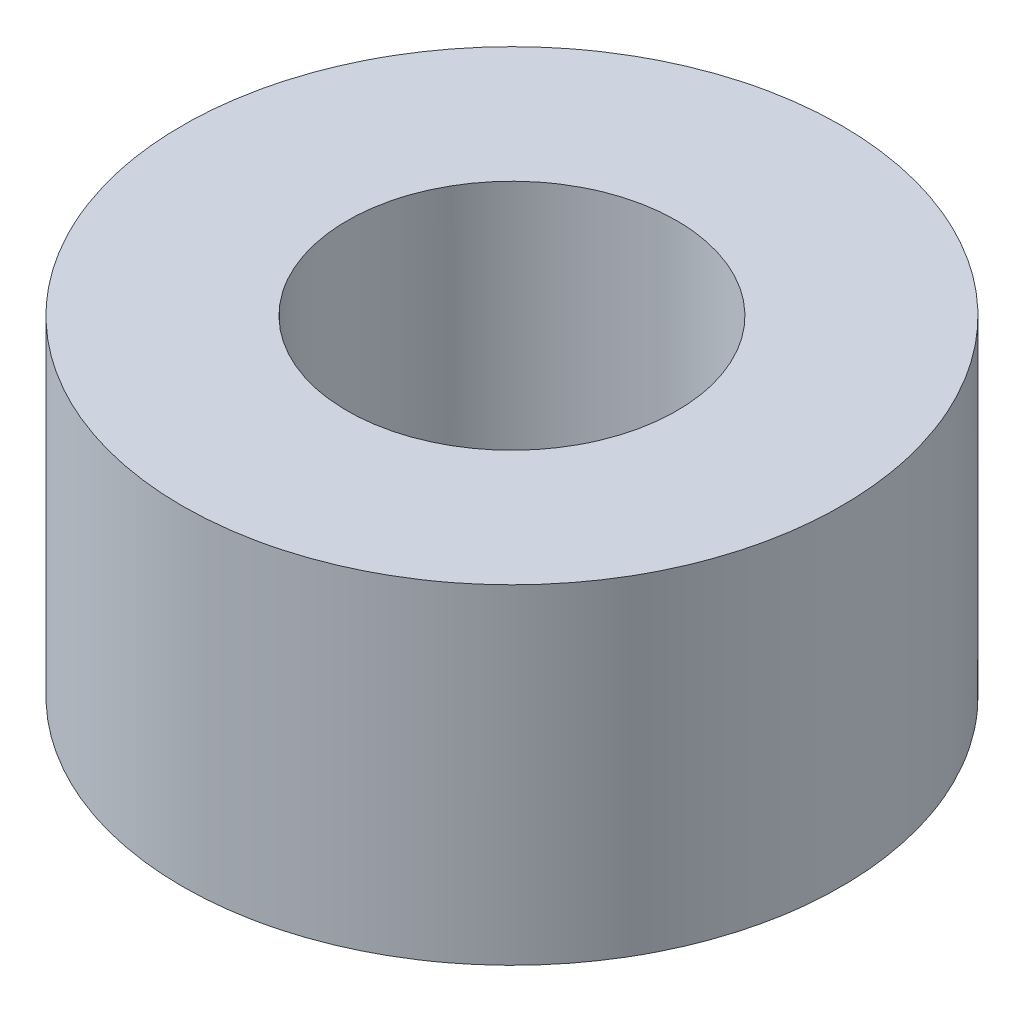
ISO-10303-21;
HEADER;
FILE_DESCRIPTION(('STEP AP214'),'2;1');
FILE_NAME('part.step','',(''),(''),'','','');
FILE_SCHEMA(('AUTOMOTIVE_DESIGN { 1 0 10303 214 1 1 1 1 }'));
ENDSEC;
DATA;
#1=APPLICATION_CONTEXT('core data for automotive mechanical design processes');
#2=APPLICATION_PROTOCOL_DEFINITION('international standard','automotive_design',2000,#1);
#3=PRODUCT_CONTEXT('',#1,'mechanical');
#4=PRODUCT('Part','Part','',(#3));
#5=PRODUCT_RELATED_PRODUCT_CATEGORY('part','',(#4));
#6=PRODUCT_DEFINITION_FORMATION('','',#4);
#7=PRODUCT_DEFINITION_CONTEXT('part definition',#1,'design');
#8=PRODUCT_DEFINITION('design','',#6,#7);
#9=PRODUCT_DEFINITION_SHAPE('','',#8);
#10=(LENGTH_UNIT() NAMED_UNIT(*) SI_UNIT(.MILLI.,.METRE.));
#11=(NAMED_UNIT(*) PLANE_ANGLE_UNIT() SI_UNIT($,.RADIAN.));
#12=(NAMED_UNIT(*) SI_UNIT($,.STERADIAN.) SOLID_ANGLE_UNIT());
#13=UNCERTAINTY_MEASURE_WITH_UNIT(LENGTH_MEASURE(1.E-05),#10,'distance_accuracy_value','');
#14=(GEOMETRIC_REPRESENTATION_CONTEXT(3) GLOBAL_UNCERTAINTY_ASSIGNED_CONTEXT((#13)) GLOBAL_UNIT_ASSIGNED_CONTEXT((#10,
#11,#12)) REPRESENTATION_CONTEXT('',''));
#15=CARTESIAN_POINT('',(0.,0.,0.));
#16=DIRECTION('',(0.,0.,1.));
#17=DIRECTION('',(1.,0.,0.));
#18=AXIS2_PLACEMENT_3D('',#15,#16,#17);
#19=CARTESIAN_POINT('',(0.,3.,-3.));
#20=CARTESIAN_POINT('',(0.,0.,-3.));
#21=(BOUNDED_CURVE() B_SPLINE_CURVE(1,(#19,#20),.UNSPECIFIED.,.F.,
.F.) B_SPLINE_CURVE_WITH_KNOTS((2,2),(0.,1.),
.UNSPECIFIED.) CURVE() GEOMETRIC_REPRESENTATION_ITEM() RATIONAL_B_SPLINE_CURVE((1.,1.)) REPRESENTATION_ITEM(''));
#22=CARTESIAN_POINT('',(0.,3.,0.));
#23=DIRECTION('',(0.,-1.,0.));
#24=AXIS1_PLACEMENT('',#22,#23);
#25=SURFACE_OF_REVOLUTION('',#21,#24);
#26=CARTESIAN_POINT('',(-8.20414035685854E-10,3.,3.));
#27=CARTESIAN_POINT('',(0.0842305911746399,3.,2.99999949525662));
#28=CARTESIAN_POINT('',(0.168476662817318,3.,2.99644943215868));
#29=CARTESIAN_POINT('',(0.336386614210605,3.,2.98227226013492));
#30=CARTESIAN_POINT('',(0.420050314709274,3.,2.97164306184346));
#31=CARTESIAN_POINT('',(0.586325719012307,3.,2.94335544057218));
#32=CARTESIAN_POINT('',(0.668935537030642,3.,2.92568585949981));
#33=CARTESIAN_POINT('',(0.832418926708934,3.,2.88343927209611));
#34=CARTESIAN_POINT('',(0.913291031827523,3.,2.85885666034446));
#35=CARTESIAN_POINT('',(1.15208820949849,3.,2.77507914707055));
#36=CARTESIAN_POINT('',(1.30659601984509,3.,2.70578575400817));
#37=CARTESIAN_POINT('',(1.60176804444093,3.,2.54220609713286));
#38=CARTESIAN_POINT('',(1.74243173215752,3.,2.44791888323482));
#39=CARTESIAN_POINT('',(1.93998804226839,3.,2.28988925210187));
#40=CARTESIAN_POINT('',(2.00363749030669,3.,2.23440451729478));
#41=CARTESIAN_POINT('',(2.12599212085923,3.,2.11831409255835));
#42=CARTESIAN_POINT('',(2.18470201122246,3.,2.0577133915789));
#43=CARTESIAN_POINT('',(2.29683360957618,3.,1.93175254767098));
#44=CARTESIAN_POINT('',(2.35025291001703,3.,1.86639026119057));
#45=CARTESIAN_POINT('',(2.45140072775192,3.,1.73140383352096));
#46=CARTESIAN_POINT('',(2.49912792413059,3.,1.66177870874426));
#47=CARTESIAN_POINT('',(2.63320682427492,3.,1.44726826456124));
#48=CARTESIAN_POINT('',(2.71057412166041,3.,1.2966147589595));
#49=CARTESIAN_POINT('',(2.83887091999447,3.,0.984538398715893));
#50=CARTESIAN_POINT('',(2.88980070330804,3.,0.823115659115253));
#51=CARTESIAN_POINT('',(2.96385049083619,3.,0.493990144199262));
#52=CARTESIAN_POINT('',(2.98697034653395,3.,0.326287335350607));
#53=CARTESIAN_POINT('',(3.0047200381422,3.,-0.0106192593920572));
#54=CARTESIAN_POINT('',(2.99934987405271,3.,-0.179823045286067));
#55=CARTESIAN_POINT('',(2.96029352960678,3.,-0.51490747876546));
#56=CARTESIAN_POINT('',(2.92660750046858,3.,-0.680788144092813));
#57=CARTESIAN_POINT('',(2.83181297821428,3.,-1.00461791671455));
#58=CARTESIAN_POINT('',(2.77070419220814,3.,-1.16256693927462));
#59=CARTESIAN_POINT('',(2.65990764694734,3.,-1.38997847742907));
#60=CARTESIAN_POINT('',(2.61976066073134,3.,-1.46423319291642));
#61=CARTESIAN_POINT('',(2.53335675213139,3.,-1.60910065394954));
#62=CARTESIAN_POINT('',(2.48710124670275,3.,-1.67971423883995));
#63=CARTESIAN_POINT('',(2.3888259817252,3.,-1.8167602232428));
#64=CARTESIAN_POINT('',(2.33680884163588,3.,-1.88319450146267));
#65=CARTESIAN_POINT('',(2.22732998452683,3.,-2.01149891362077));
#66=CARTESIAN_POINT('',(2.16986306149661,3.,-2.07336458091398));
#67=CARTESIAN_POINT('',(1.99000567890308,3.,-2.25127799217701));
#68=CARTESIAN_POINT('',(1.86002810664727,3.,-2.35982375421848));
#69=CARTESIAN_POINT('',(1.58367858099263,3.,-2.55351362983904));
#70=CARTESIAN_POINT('',(1.43730725104369,3.,-2.63865863291721));
#71=CARTESIAN_POINT('',(1.20863511930439,3.,-2.74706444438359));
#72=CARTESIAN_POINT('',(1.13079378091769,3.,-2.78000876445511));
#73=CARTESIAN_POINT('',(0.972654563354269,3.,-2.83919981712553));
#74=CARTESIAN_POINT('',(0.892358731600841,3.,-2.86545197001395));
#75=CARTESIAN_POINT('',(0.72997618994692,3.,-2.91105470852067));
#76=CARTESIAN_POINT('',(0.647892527851414,3.,-2.93041619230863));
#77=CARTESIAN_POINT('',(0.482401804622163,3.,-2.96215834895697));
#78=CARTESIAN_POINT('',(0.398995141292236,3.,-2.97454108078118));
#79=CARTESIAN_POINT('',(0.262882670435773,3.,-2.98892380778573));
#80=CARTESIAN_POINT('',(0.210394788602458,3.,-2.99307606544695));
#81=CARTESIAN_POINT('',(0.105273286357475,3.,-2.99861431928182));
#82=CARTESIAN_POINT('',(0.0526396659458052,3.,-3.00000031545547));
#83=CARTESIAN_POINT('',(-0.0842305921750378,3.,-2.99999949522854));
#84=CARTESIAN_POINT('',(-0.168476663816767,3.,-2.99644943210249));
#85=CARTESIAN_POINT('',(-0.336386615205739,3.,-2.98227226002267));
#86=CARTESIAN_POINT('',(-0.420050315701042,3.,-2.97164306170328));
#87=CARTESIAN_POINT('',(-0.586325719994559,3.,-2.9433554403765));
#88=CARTESIAN_POINT('',(-0.668935538006743,3.,-2.92568585927662));
#89=CARTESIAN_POINT('',(-0.832418927670488,3.,-2.88343927181851));
#90=CARTESIAN_POINT('',(-0.913291032780675,3.,-2.85885666003996));
#91=CARTESIAN_POINT('',(-1.15208821042353,3.,-2.77507914668652));
#92=CARTESIAN_POINT('',(-1.30659602074704,3.,-2.70578575357263));
#93=CARTESIAN_POINT('',(-1.60176804528835,3.,-2.54220609659893));
#94=CARTESIAN_POINT('',(-1.7424317329735,3.,-2.44791888265401));
#95=CARTESIAN_POINT('',(-1.9399880430317,3.,-2.2898892514552));
#96=CARTESIAN_POINT('',(-2.00363749105151,3.,-2.23440451662689));
#97=CARTESIAN_POINT('',(-2.12599212156537,3.,-2.11831409184965));
#98=CARTESIAN_POINT('',(-2.18470201190841,3.,-2.05771339085062));
#99=CARTESIAN_POINT('',(-2.29683361022014,3.,-1.93175254690532));
#100=CARTESIAN_POINT('',(-2.35025291063919,3.,-1.86639026040711));
#101=CARTESIAN_POINT('',(-2.45140072832907,3.,-1.7314038327038));
#102=CARTESIAN_POINT('',(-2.49912792468452,3.,-1.6617787079112));
#103=CARTESIAN_POINT('',(-2.63320682475734,3.,-1.44726826368351));
#104=CARTESIAN_POINT('',(-2.71057412209261,3.,-1.29661475805599));
#105=CARTESIAN_POINT('',(-2.83887092032264,3.,-0.984538397769613));
#106=CARTESIAN_POINT('',(-2.88980070358241,3.,-0.823115658151992));
#107=CARTESIAN_POINT('',(-2.96385049100085,3.,-0.493990143211312));
#108=CARTESIAN_POINT('',(-2.98697034664271,3.,-0.326287334354949));
#109=CARTESIAN_POINT('',(-3.00472003813866,3.,0.0106192603936318));
#110=CARTESIAN_POINT('',(-2.99934987399276,3.,0.17982304628585));
#111=CARTESIAN_POINT('',(-2.96029352943515,3.,0.514907479752218));
#112=CARTESIAN_POINT('',(-2.92660750024165,3.,0.680788145068337));
#113=CARTESIAN_POINT('',(-2.83181297787941,3.,1.00461791765848));
#114=CARTESIAN_POINT('',(-2.77070419182062,3.,1.16256694019818));
#115=CARTESIAN_POINT('',(-2.65990764648401,3.,1.38997847831572));
#116=CARTESIAN_POINT('',(-2.61976066024325,3.,1.4642331937897));
#117=CARTESIAN_POINT('',(-2.533356751595,3.,1.60910065479403));
#118=CARTESIAN_POINT('',(-2.48710124614281,3.,1.67971423966904));
#119=CARTESIAN_POINT('',(-2.38882598111958,3.,1.81676022403913));
#120=CARTESIAN_POINT('',(-2.33680884100812,3.,1.88319450224164));
#121=CARTESIAN_POINT('',(-2.22732998385631,3.,2.01149891436324));
#122=CARTESIAN_POINT('',(-2.16986306080548,3.,2.07336458163727));
#123=CARTESIAN_POINT('',(-1.99000567815265,3.,2.25127799284035));
#124=CARTESIAN_POINT('',(-1.86002810586064,3.,2.35982375483851));
#125=CARTESIAN_POINT('',(-1.58367858014144,3.,2.55351363036695));
#126=CARTESIAN_POINT('',(-1.43730725016412,3.,2.63865863339631));
#127=CARTESIAN_POINT('',(-1.20863511838851,3.,2.74706444478656));
#128=CARTESIAN_POINT('',(-1.13079377999063,3.,2.78000876483221));
#129=CARTESIAN_POINT('',(-0.972654562407022,3.,2.83919981745005));
#130=CARTESIAN_POINT('',(-0.892358730644588,3.,2.86545197031175));
#131=CARTESIAN_POINT('',(-0.729976188975372,3.,2.91105470876429));
#132=CARTESIAN_POINT('',(-0.647892526873583,3.,2.93041619252482));
#133=CARTESIAN_POINT('',(-0.482401803634151,3.,2.96215834911786));
#134=CARTESIAN_POINT('',(-0.398995140300326,3.,2.97454108091422));
#135=CARTESIAN_POINT('',(-0.262882669770961,3.,2.98892380783833));
#136=CARTESIAN_POINT('',(-0.210394788269591,3.,2.99307606546448));
#137=CARTESIAN_POINT('',(-0.105273286690342,3.,2.99861431926428));
#138=CARTESIAN_POINT('',(-0.0526396666124634,3.,3.00000031543792));
#139=CARTESIAN_POINT('',(-8.20414035685854E-10,3.,3.));
#140=B_SPLINE_CURVE_WITH_KNOTS('',3,(#26,#27,#28,#29,#30,#31,#32,#33,#34,#35,#36,#37,#38,#39,
#40,#41,#42,#43,#44,#45,#46,#47,#48,#49,#50,#51,#52,#53,#54,#55,#56,#57,#58,#59,#60,#61,#62,#63,
#64,#65,#66,#67,#68,#69,#70,#71,#72,#73,#74,#75,#76,#77,#78,#79,#80,#81,#82,#83,#84,#85,#86,#87,
#88,#89,#90,#91,#92,#93,#94,#95,#96,#97,#98,#99,#100,#101,#102,#103,#104,#105,#106,#107,#108,
#109,#110,#111,#112,#113,#114,#115,#116,#117,#118,#119,#120,#121,#122,#123,#124,#125,#126,#127,
#128,#129,#130,#131,#132,#133,#134,#135,#136,#137,#138,#139),.UNSPECIFIED.,.T.,.F.,(4,2,2,2,2,2,
2,2,2,2,2,2,2,2,2,2,2,2,2,2,2,2,2,2,2,2,2,2,2,2,2,2,2,2,2,2,2,2,2,2,2,2,2,2,2,2,2,2,2,2,2,2,2,2,
2,2,4),(0.,0.252643316183632,0.505361231638463,0.758481275541989,1.01180715618274,
1.51725134291914,2.02271474576028,2.27577762012546,2.52859650376456,2.78152991223792,
3.03452190295018,3.53997839705091,4.04542949252892,4.55088328731834,5.05633708210776,
5.56178817758579,6.0672446716865,6.32023666239873,6.57317007087204,6.82598895451119,
7.07905182887641,7.58451523171751,8.08995941845395,8.34328529909405,8.59640534299682,
8.84912325845214,9.10176657463668,9.25965528819913,9.41754400176159,9.67018731794613,
9.92290523340145,10.1760252773042,10.4293511579443,10.9347953446808,11.4402587475219,
11.6933216218871,11.9461405055262,12.1990739139995,12.4520659047118,12.9575223988125,
13.4629734942905,13.9684272890799,14.4738810838693,14.9793321793474,15.4847886734481,
15.7377806641604,15.9907140726337,16.2435329562728,16.496595830638,17.0020592334791,
17.5075034202155,17.7608293008563,18.0139493447598,18.2666672602146,18.5193105763983,
18.6771992889611,18.8350880015239),.UNSPECIFIED.);
#141=CARTESIAN_POINT('',(-8.20414035685854E-10,3.,3.));
#142=VERTEX_POINT('',#141);
#143=EDGE_CURVE('E20',#142,#142,#140,.T.);
#144=ORIENTED_EDGE('',*,*,#143,.F.);
#145=EDGE_LOOP('',(#144));
#146=FACE_BOUND('',#145,.T.);
#147=CARTESIAN_POINT('',(-1.79585082180927E-10,0.,-3.));
#148=CARTESIAN_POINT('',(-0.0842305921750378,0.,-2.99999949522854));
#149=CARTESIAN_POINT('',(-0.168476663816767,0.,-2.99644943210249));
#150=CARTESIAN_POINT('',(-0.336386615205739,0.,-2.98227226002267));
#151=CARTESIAN_POINT('',(-0.420050315701042,0.,-2.97164306170328));
#152=CARTESIAN_POINT('',(-0.586325719994559,0.,-2.9433554403765));
#153=CARTESIAN_POINT('',(-0.668935538006743,0.,-2.92568585927662));
#154=CARTESIAN_POINT('',(-0.832418927670488,0.,-2.88343927181851));
#155=CARTESIAN_POINT('',(-0.913291032780675,0.,-2.85885666003996));
#156=CARTESIAN_POINT('',(-1.15208821042353,0.,-2.77507914668652));
#157=CARTESIAN_POINT('',(-1.30659602074704,0.,-2.70578575357263));
#158=CARTESIAN_POINT('',(-1.60176804528835,0.,-2.54220609659893));
#159=CARTESIAN_POINT('',(-1.7424317329735,0.,-2.44791888265401));
#160=CARTESIAN_POINT('',(-1.9399880430317,0.,-2.2898892514552));
#161=CARTESIAN_POINT('',(-2.00363749105151,0.,-2.23440451662689));
#162=CARTESIAN_POINT('',(-2.12599212156537,0.,-2.11831409184965));
#163=CARTESIAN_POINT('',(-2.18470201190841,0.,-2.05771339085062));
#164=CARTESIAN_POINT('',(-2.29683361022014,0.,-1.93175254690532));
#165=CARTESIAN_POINT('',(-2.35025291063919,0.,-1.86639026040711));
#166=CARTESIAN_POINT('',(-2.45140072832907,0.,-1.7314038327038));
#167=CARTESIAN_POINT('',(-2.49912792468452,0.,-1.6617787079112));
#168=CARTESIAN_POINT('',(-2.63320682475734,0.,-1.44726826368351));
#169=CARTESIAN_POINT('',(-2.71057412209261,0.,-1.29661475805599));
#170=CARTESIAN_POINT('',(-2.83887092032264,0.,-0.984538397769613));
#171=CARTESIAN_POINT('',(-2.88980070358241,0.,-0.823115658151992));
#172=CARTESIAN_POINT('',(-2.96385049100085,0.,-0.493990143211312));
#173=CARTESIAN_POINT('',(-2.98697034664271,0.,-0.326287334354949));
#174=CARTESIAN_POINT('',(-3.00472003813866,0.,0.0106192603936318));
#175=CARTESIAN_POINT('',(-2.99934987399276,0.,0.17982304628585));
#176=CARTESIAN_POINT('',(-2.96029352943515,0.,0.514907479752218));
#177=CARTESIAN_POINT('',(-2.92660750024165,0.,0.680788145068337));
#178=CARTESIAN_POINT('',(-2.83181297787941,0.,1.00461791765848));
#179=CARTESIAN_POINT('',(-2.77070419182062,0.,1.16256694019818));
#180=CARTESIAN_POINT('',(-2.65990764648401,0.,1.38997847831572));
#181=CARTESIAN_POINT('',(-2.61976066024325,0.,1.4642331937897));
#182=CARTESIAN_POINT('',(-2.533356751595,0.,1.60910065479403));
#183=CARTESIAN_POINT('',(-2.48710124614281,0.,1.67971423966904));
#184=CARTESIAN_POINT('',(-2.38882598111958,0.,1.81676022403913));
#185=CARTESIAN_POINT('',(-2.33680884100812,0.,1.88319450224164));
#186=CARTESIAN_POINT('',(-2.22732998385631,0.,2.01149891436324));
#187=CARTESIAN_POINT('',(-2.16986306080548,0.,2.07336458163727));
#188=CARTESIAN_POINT('',(-1.99000567815265,0.,2.25127799284035));
#189=CARTESIAN_POINT('',(-1.86002810586064,0.,2.35982375483851));
#190=CARTESIAN_POINT('',(-1.58367858014144,0.,2.55351363036695));
#191=CARTESIAN_POINT('',(-1.43730725016412,0.,2.63865863339631));
#192=CARTESIAN_POINT('',(-1.20863511838851,0.,2.74706444478656));
#193=CARTESIAN_POINT('',(-1.13079377999063,0.,2.78000876483221));
#194=CARTESIAN_POINT('',(-0.972654562407022,0.,2.83919981745005));
#195=CARTESIAN_POINT('',(-0.892358730644588,0.,2.86545197031175));
#196=CARTESIAN_POINT('',(-0.729976188975372,0.,2.91105470876429));
#197=CARTESIAN_POINT('',(-0.647892526873583,0.,2.93041619252482));
#198=CARTESIAN_POINT('',(-0.482401803634151,0.,2.96215834911786));
#199=CARTESIAN_POINT('',(-0.398995140300326,0.,2.97454108091422));
#200=CARTESIAN_POINT('',(-0.262882669770961,0.,2.98892380783833));
#201=CARTESIAN_POINT('',(-0.210394788269591,0.,2.99307606546448));
#202=CARTESIAN_POINT('',(-0.105273286690342,0.,2.99861431926428));
#203=CARTESIAN_POINT('',(-0.0526396666124634,0.,3.00000031543792));
#204=CARTESIAN_POINT('',(0.08423059117464,0.,2.99999949525662));
#205=CARTESIAN_POINT('',(0.168476662817318,0.,2.99644943215868));
#206=CARTESIAN_POINT('',(0.336386614210605,0.,2.98227226013492));
#207=CARTESIAN_POINT('',(0.420050314709274,0.,2.97164306184346));
#208=CARTESIAN_POINT('',(0.586325719012307,0.,2.94335544057218));
#209=CARTESIAN_POINT('',(0.668935537030642,0.,2.92568585949981));
#210=CARTESIAN_POINT('',(0.832418926708934,0.,2.88343927209611));
#211=CARTESIAN_POINT('',(0.913291031827523,0.,2.85885666034446));
#212=CARTESIAN_POINT('',(1.15208820949849,0.,2.77507914707055));
#213=CARTESIAN_POINT('',(1.30659601984509,0.,2.70578575400817));
#214=CARTESIAN_POINT('',(1.60176804444093,0.,2.54220609713286));
#215=CARTESIAN_POINT('',(1.74243173215752,0.,2.44791888323482));
#216=CARTESIAN_POINT('',(1.93998804226839,0.,2.28988925210187));
#217=CARTESIAN_POINT('',(2.00363749030669,0.,2.23440451729478));
#218=CARTESIAN_POINT('',(2.12599212085923,0.,2.11831409255835));
#219=CARTESIAN_POINT('',(2.18470201122246,0.,2.0577133915789));
#220=CARTESIAN_POINT('',(2.29683360957618,0.,1.93175254767098));
#221=CARTESIAN_POINT('',(2.35025291001703,0.,1.86639026119057));
#222=CARTESIAN_POINT('',(2.45140072775192,0.,1.73140383352096));
#223=CARTESIAN_POINT('',(2.49912792413059,0.,1.66177870874426));
#224=CARTESIAN_POINT('',(2.63320682427492,0.,1.44726826456124));
#225=CARTESIAN_POINT('',(2.71057412166041,0.,1.2966147589595));
#226=CARTESIAN_POINT('',(2.83887091999447,0.,0.984538398715893));
#227=CARTESIAN_POINT('',(2.88980070330804,0.,0.823115659115253));
#228=CARTESIAN_POINT('',(2.96385049083619,0.,0.493990144199262));
#229=CARTESIAN_POINT('',(2.98697034653395,0.,0.326287335350607));
#230=CARTESIAN_POINT('',(3.0047200381422,0.,-0.0106192593920572));
#231=CARTESIAN_POINT('',(2.99934987405271,0.,-0.179823045286067));
#232=CARTESIAN_POINT('',(2.96029352960678,0.,-0.51490747876546));
#233=CARTESIAN_POINT('',(2.92660750046858,0.,-0.680788144092813));
#234=CARTESIAN_POINT('',(2.83181297821428,0.,-1.00461791671455));
#235=CARTESIAN_POINT('',(2.77070419220814,0.,-1.16256693927462));
#236=CARTESIAN_POINT('',(2.65990764694734,0.,-1.38997847742907));
#237=CARTESIAN_POINT('',(2.61976066073134,0.,-1.46423319291642));
#238=CARTESIAN_POINT('',(2.53335675213139,0.,-1.60910065394954));
#239=CARTESIAN_POINT('',(2.48710124670275,0.,-1.67971423883995));
#240=CARTESIAN_POINT('',(2.3888259817252,0.,-1.8167602232428));
#241=CARTESIAN_POINT('',(2.33680884163588,0.,-1.88319450146267));
#242=CARTESIAN_POINT('',(2.22732998452683,0.,-2.01149891362077));
#243=CARTESIAN_POINT('',(2.16986306149661,0.,-2.07336458091398));
#244=CARTESIAN_POINT('',(1.99000567890308,0.,-2.25127799217701));
#245=CARTESIAN_POINT('',(1.86002810664727,0.,-2.35982375421848));
#246=CARTESIAN_POINT('',(1.58367858099263,0.,-2.55351362983904));
#247=CARTESIAN_POINT('',(1.43730725104369,0.,-2.63865863291721));
#248=CARTESIAN_POINT('',(1.20863511930439,0.,-2.74706444438359));
#249=CARTESIAN_POINT('',(1.13079378091769,0.,-2.78000876445511));
#250=CARTESIAN_POINT('',(0.972654563354269,0.,-2.83919981712553));
#251=CARTESIAN_POINT('',(0.892358731600841,0.,-2.86545197001395));
#252=CARTESIAN_POINT('',(0.72997618994692,0.,-2.91105470852067));
#253=CARTESIAN_POINT('',(0.647892527851414,0.,-2.93041619230863));
#254=CARTESIAN_POINT('',(0.482401804622163,0.,-2.96215834895697));
#255=CARTESIAN_POINT('',(0.398995141292235,0.,-2.97454108078118));
#256=CARTESIAN_POINT('',(0.262882670435773,0.,-2.98892380778573));
#257=CARTESIAN_POINT('',(0.210394788602458,0.,-2.99307606544695));
#258=CARTESIAN_POINT('',(0.105273286357475,0.,-2.99861431928182));
#259=CARTESIAN_POINT('',(0.0526396659458052,0.,-3.00000031545547));
#260=CARTESIAN_POINT('',(-1.79585082180927E-10,0.,-3.));
#261=B_SPLINE_CURVE_WITH_KNOTS('',3,(#147,#148,#149,#150,#151,#152,#153,#154,#155,#156,#157,
#158,#159,#160,#161,#162,#163,#164,#165,#166,#167,#168,#169,#170,#171,#172,#173,#174,#175,#176,
#177,#178,#179,#180,#181,#182,#183,#184,#185,#186,#187,#188,#189,#190,#191,#192,#193,#194,#195,
#196,#197,#198,#199,#200,#201,#202,#203,#204,#205,#206,#207,#208,#209,#210,#211,#212,#213,#214,
#215,#216,#217,#218,#219,#220,#221,#222,#223,#224,#225,#226,#227,#228,#229,#230,#231,#232,#233,
#234,#235,#236,#237,#238,#239,#240,#241,#242,#243,#244,#245,#246,#247,#248,#249,#250,#251,#252,
#253,#254,#255,#256,#257,#258,#259,#260),.UNSPECIFIED.,.T.,.F.,(4,2,2,2,2,2,2,2,2,2,2,2,2,2,2,2,
2,2,2,2,2,2,2,2,2,2,2,2,2,2,2,2,2,2,2,2,2,2,2,2,2,2,2,2,2,2,2,2,2,2,2,2,2,2,2,2,4),(0.,
0.252643316184542,0.505361231639865,0.758481275542631,1.01180715618274,1.51725134291917,
2.02271474576027,2.27577762012549,2.52859650376464,2.78152991223796,3.03452190295018,
3.53997839705089,4.04542949252892,4.55088328731834,5.05633708210776,5.56178817758577,
6.0672446716865,6.32023666239877,6.57317007087212,6.82598895451123,7.07905182887641,
7.58451523171754,8.08995941845395,8.34328529909469,8.59640534299822,8.84912325845305,
9.10176657463668,9.25965528719948,9.41754399976228,9.67018731594591,9.92290523140074,
10.1760252753043,10.429351155945,10.9347953426814,11.4402587455226,11.6933216198877,
11.9461405035268,12.1990739120002,12.4520659027125,12.9575223968132,13.4629734922912,
13.9684272870806,14.47388108187,14.9793321773481,15.4847886714488,15.737780662161,
15.9907140706343,16.2435329542735,16.4965958286387,17.0020592314798,17.5075034182162,
17.7608292988563,18.0139493427591,18.2666672582144,18.519310574399,18.6771992879614,
18.8350880015239),.UNSPECIFIED.);
#262=CARTESIAN_POINT('',(-1.79585082180927E-10,0.,-3.));
#263=VERTEX_POINT('',#262);
#264=EDGE_CURVE('E38',#263,#263,#261,.T.);
#265=ORIENTED_EDGE('',*,*,#264,.T.);
#266=EDGE_LOOP('',(#265));
#267=FACE_BOUND('',#266,.T.);
#268=ADVANCED_FACE('F15',(#146,#267),#25,.T.);
#269=CARTESIAN_POINT('',(-3.036,3.,-3.036));
#270=DIRECTION('',(0.,1.,0.));
#271=DIRECTION('',(0.,0.,1.));
#272=AXIS2_PLACEMENT_3D('',#269,#270,#271);
#273=PLANE('',#272);
#274=CARTESIAN_POINT('',(-8.97925410904633E-11,3.,-1.5));
#275=CARTESIAN_POINT('',(-0.0841929853686145,3.,-1.49999523298243));
#276=CARTESIAN_POINT('',(-0.168535810317971,3.,-1.4928725286293));
#277=CARTESIAN_POINT('',(-0.293182657300319,3.,-1.47167805287467));
#278=CARTESIAN_POINT('',(-0.334473199666022,3.,-1.46284300913073));
#279=CARTESIAN_POINT('',(-0.416204028756389,3.,-1.44171955635219));
#280=CARTESIAN_POINT('',(-0.456643596749716,3.,-1.42942834489005));
#281=CARTESIAN_POINT('',(-0.576047935342307,3.,-1.387539543674));
#282=CARTESIAN_POINT('',(-0.653299317835815,3.,-1.3528923823405));
#283=CARTESIAN_POINT('',(-0.800882715132173,3.,-1.27110354276407));
#284=CARTESIAN_POINT('',(-0.871214466761097,3.,-1.22396138955152));
#285=CARTESIAN_POINT('',(-0.969994722295757,3.,-1.14494365033889));
#286=CARTESIAN_POINT('',(-1.00182052104854,3.,-1.11719945480952));
#287=CARTESIAN_POINT('',(-1.06299428697178,3.,-1.05915984672575));
#288=CARTESIAN_POINT('',(-1.09234461356026,3.,-1.02886691971943));
#289=CARTESIAN_POINT('',(-1.17642545967529,3.,-0.934407212535112));
#290=CARTESIAN_POINT('',(-1.22720721208367,3.,-0.866642380076199));
#291=CARTESIAN_POINT('',(-1.31664307596884,3.,-0.723585814634726));
#292=CARTESIAN_POINT('',(-1.35529764474337,3.,-0.64829436561069));
#293=CARTESIAN_POINT('',(-1.4194248765773,3.,-0.492282212163118));
#294=CARTESIAN_POINT('',(-1.44489768042412,3.,-0.411561565736348));
#295=CARTESIAN_POINT('',(-1.48192791688178,3.,-0.246991334925349));
#296=CARTESIAN_POINT('',(-1.49348527517824,3.,-0.163141733833639));
#297=CARTESIAN_POINT('',(-1.50235991721245,3.,0.00530769685298037));
#298=CARTESIAN_POINT('',(-1.49967720095019,3.,0.08990752644789));
#299=CARTESIAN_POINT('',(-1.48014450077586,3.,0.2574577365498));
#300=CARTESIAN_POINT('',(-1.46329459252233,3.,0.34040812586306));
#301=CARTESIAN_POINT('',(-1.41591564663601,3.,0.502294905350247));
#302=CARTESIAN_POINT('',(-1.38538646290107,3.,0.581231252641984));
#303=CARTESIAN_POINT('',(-1.31147765734374,3.,0.732893519293556));
#304=CARTESIAN_POINT('',(-1.26809755091768,3.,0.805619204318291));
#305=CARTESIAN_POINT('',(-1.19440770789133,3.,0.908390951406295));
#306=CARTESIAN_POINT('',(-1.16840295081246,3.,0.941600222803434));
#307=CARTESIAN_POINT('',(-1.11366646303812,3.,1.00574648263109));
#308=CARTESIAN_POINT('',(-1.08493212481231,3.,1.03668124719376));
#309=CARTESIAN_POINT('',(-0.995001651812942,3.,1.12564108093843));
#310=CARTESIAN_POINT('',(-0.930012804613422,3.,1.17991250653595));
#311=CARTESIAN_POINT('',(-0.791840538340161,3.,1.2767561860907));
#312=CARTESIAN_POINT('',(-0.718657430891806,3.,1.31932888473465));
#313=CARTESIAN_POINT('',(-0.604315651743086,3.,1.37353243889104));
#314=CARTESIAN_POINT('',(-0.56539147664493,3.,1.39000487440105));
#315=CARTESIAN_POINT('',(-0.486332690155345,3.,1.41959941713983));
#316=CARTESIAN_POINT('',(-0.446199087987001,3.,1.43272423576006));
#317=CARTESIAN_POINT('',(-0.324469325584775,3.,1.46689889319274));
#318=CARTESIAN_POINT('',(-0.241341846856378,3.,1.48284465494913));
#319=CARTESIAN_POINT('',(-0.131433795422408,3.,1.49446404091507));
#320=CARTESIAN_POINT('',(-0.105193578700441,3.,1.49653823374577));
#321=CARTESIAN_POINT('',(-0.0526404587795256,3.,1.49930695861861));
#322=CARTESIAN_POINT('',(-0.0263275555805777,3.,1.50000149066075));
#323=CARTESIAN_POINT('',(0.0841929848681515,3.,1.49999523301051));
#324=CARTESIAN_POINT('',(0.168535809819837,3.,1.49287252868552));
#325=CARTESIAN_POINT('',(0.293182656809218,3.,1.47167805297251));
#326=CARTESIAN_POINT('',(0.334473199177978,3.,1.46284300924232));
#327=CARTESIAN_POINT('',(0.416204028275605,3.,1.44171955649099));
#328=CARTESIAN_POINT('',(0.456643596273137,3.,1.4294283450423));
#329=CARTESIAN_POINT('',(0.576047934879793,3.,1.38753954386601));
#330=CARTESIAN_POINT('',(0.653299317384843,3.,1.35289238255827));
#331=CARTESIAN_POINT('',(0.800882714708462,3.,1.27110354303104));
#332=CARTESIAN_POINT('',(0.871214466353107,3.,1.22396138984193));
#333=CARTESIAN_POINT('',(0.969994721914106,3.,1.14494365066222));
#334=CARTESIAN_POINT('',(1.00182052067613,3.,1.11719945514347));
#335=CARTESIAN_POINT('',(1.06299428661871,3.,1.0591598470801));
#336=CARTESIAN_POINT('',(1.09234461321728,3.,1.02886692008357));
#337=CARTESIAN_POINT('',(1.17642545936381,3.,0.934407212927276));
#338=CARTESIAN_POINT('',(1.22720721179478,3.,0.866642380485279));
#339=CARTESIAN_POINT('',(1.31664307572765,3.,0.723585815073605));
#340=CARTESIAN_POINT('',(1.35529764452727,3.,0.648294366062451));
#341=CARTESIAN_POINT('',(1.41942487641321,3.,0.492282212636254));
#342=CARTESIAN_POINT('',(1.44489768028693,3.,0.411561566217978));
#343=CARTESIAN_POINT('',(1.48192791679945,3.,0.246991335419325));
#344=CARTESIAN_POINT('',(1.49348527512386,3.,0.163141734331468));
#345=CARTESIAN_POINT('',(1.50235991721422,3.,-0.00530769635219311));
#346=CARTESIAN_POINT('',(1.49967720098016,3.,-0.0899075259479977));
#347=CARTESIAN_POINT('',(1.48014450086167,3.,-0.257457736056422));
#348=CARTESIAN_POINT('',(1.4632945926358,3.,-0.340408125375301));
#349=CARTESIAN_POINT('',(1.41591564680344,3.,-0.502294904878281));
#350=CARTESIAN_POINT('',(1.38538646309481,3.,-0.581231252180192));
#351=CARTESIAN_POINT('',(1.31147765758804,3.,-0.732893518856384));
#352=CARTESIAN_POINT('',(1.26809755118624,3.,-0.805619203895568));
#353=CARTESIAN_POINT('',(1.19440770819415,3.,-0.908390951008132));
#354=CARTESIAN_POINT('',(1.16840295112635,3.,-0.941600222413946));
#355=CARTESIAN_POINT('',(1.11366646337338,3.,-1.00574648225986));
#356=CARTESIAN_POINT('',(1.08493212515787,3.,-1.03668124683211));
#357=CARTESIAN_POINT('',(0.995001652188161,3.,-1.12564108060676));
#358=CARTESIAN_POINT('',(0.930012805006736,3.,-1.17991250622593));
#359=CARTESIAN_POINT('',(0.791840538765754,3.,-1.27675618582675));
#360=CARTESIAN_POINT('',(0.718657431331583,3.,-1.31932888449509));
#361=CARTESIAN_POINT('',(0.604315652201028,3.,-1.37353243868956));
#362=CARTESIAN_POINT('',(0.565391477108468,3.,-1.3900048742125));
#363=CARTESIAN_POINT('',(0.486332690628961,3.,-1.41959941697758));
#364=CARTESIAN_POINT('',(0.446199088465102,3.,-1.43272423561115));
#365=CARTESIAN_POINT('',(0.324469326074245,3.,-1.46689889308449));
#366=CARTESIAN_POINT('',(0.24134184735112,3.,-1.48284465486862));
#367=CARTESIAN_POINT('',(0.131433795754725,3.,-1.49446404088879));
#368=CARTESIAN_POINT('',(0.10519357886683,3.,-1.496538233737));
#369=CARTESIAN_POINT('',(0.0526404586131369,3.,-1.49930695862738));
#370=CARTESIAN_POINT('',(0.0263275552473398,3.,-1.50000149066954));
#371=CARTESIAN_POINT('',(-8.97925410904633E-11,3.,-1.5));
#372=B_SPLINE_CURVE_WITH_KNOTS('',3,(#274,#275,#276,#277,#278,#279,#280,#281,#282,#283,#284,
#285,#286,#287,#288,#289,#290,#291,#292,#293,#294,#295,#296,#297,#298,#299,#300,#301,#302,#303,
#304,#305,#306,#307,#308,#309,#310,#311,#312,#313,#314,#315,#316,#317,#318,#319,#320,#321,#322,
#323,#324,#325,#326,#327,#328,#329,#330,#331,#332,#333,#334,#335,#336,#337,#338,#339,#340,#341,
#342,#343,#344,#345,#346,#347,#348,#349,#350,#351,#352,#353,#354,#355,#356,#357,#358,#359,#360,
#361,#362,#363,#364,#365,#366,#367,#368,#369,#370,#371),.UNSPECIFIED.,.T.,.F.,(4,2,2,2,2,2,2,2,
2,2,2,2,2,2,2,2,2,2,2,2,2,2,2,2,2,2,2,2,2,2,2,2,2,2,2,2,2,2,2,2,2,2,2,2,2,2,2,2,4),(0.,
0.252456446609514,0.379016468560898,0.505679408880951,0.758401502249168,1.01113320366972,
1.13766464085233,1.2640740826719,1.51681186122693,1.76954010827728,2.0222656560163,
2.27499255341101,2.52771945080572,2.78044499854472,3.03317324559509,3.28591102415015,
3.41232046596971,3.5388519031523,3.79158360457287,4.04430569794107,4.17096863826144,
4.2975286602132,4.54998510682202,4.62892946310342,4.70787381938482,4.96033026599363,
5.08689028794539,5.21355322826577,5.46627532163397,5.71900702305454,5.84553846023713,
5.97194790205668,6.22468568061175,6.47741392766211,6.73013947540112,6.98286637279583,
7.23559327019054,7.48831881792955,7.74104706497991,7.99378484353493,8.12019428535451,
8.24672572253711,8.49945742395767,8.75217951732588,8.87884245764594,9.00540247959732,
9.25785892620684,9.33680328298806,9.41574763976929),.UNSPECIFIED.);
#373=CARTESIAN_POINT('',(-8.97925410904633E-11,3.,-1.5));
#374=VERTEX_POINT('',#373);
#375=EDGE_CURVE('E29',#374,#374,#372,.T.);
#376=ORIENTED_EDGE('',*,*,#375,.F.);
#377=EDGE_LOOP('',(#376));
#378=FACE_BOUND('',#377,.T.);
#379=ORIENTED_EDGE('',*,*,#143,.T.);
#380=EDGE_LOOP('',(#379));
#381=FACE_BOUND('',#380,.T.);
#382=ADVANCED_FACE('F64',(#378,#381),#273,.T.);
#383=CARTESIAN_POINT('',(-3.036,0.,-3.036));
#384=DIRECTION('',(0.,1.,0.));
#385=DIRECTION('',(0.,0.,1.));
#386=AXIS2_PLACEMENT_3D('',#383,#384,#385);
#387=PLANE('',#386);
#388=CARTESIAN_POINT('',(-4.10207017842927E-10,0.,1.5));
#389=CARTESIAN_POINT('',(-0.084192985689028,0.,1.49999523296445));
#390=CARTESIAN_POINT('',(-0.168535810636863,0.,1.49287252859329));
#391=CARTESIAN_POINT('',(-0.293182657614683,0.,1.47167805281204));
#392=CARTESIAN_POINT('',(-0.334473199978499,0.,1.46284300905928));
#393=CARTESIAN_POINT('',(-0.416204029064354,0.,1.44171955626329));
#394=CARTESIAN_POINT('',(-0.456643597055056,0.,1.42942834479251));
#395=CARTESIAN_POINT('',(-0.576047935638699,0.,1.38753954355095));
#396=CARTESIAN_POINT('',(-0.653299318124806,0.,1.35289238220095));
#397=CARTESIAN_POINT('',(-0.800882715403693,0.,1.271103542593));
#398=CARTESIAN_POINT('',(-0.871214467022548,0.,1.22396138936542));
#399=CARTESIAN_POINT('',(-0.969994722540328,0.,1.14494365013169));
#400=CARTESIAN_POINT('',(-1.00182052128718,0.,1.11719945459553));
#401=CARTESIAN_POINT('',(-1.06299428719802,0.,1.05915984649868));
#402=CARTESIAN_POINT('',(-1.09234461378003,0.,1.0288669194861));
#403=CARTESIAN_POINT('',(-1.17642545987489,0.,0.934407212283817));
#404=CARTESIAN_POINT('',(-1.2272072122688,0.,0.866642379814056));
#405=CARTESIAN_POINT('',(-1.31664307612341,0.,0.723585814353479));
#406=CARTESIAN_POINT('',(-1.35529764488185,0.,0.648294365321186));
#407=CARTESIAN_POINT('',(-1.41942487668246,0.,0.492282211859915));
#408=CARTESIAN_POINT('',(-1.44489768051203,0.,0.411561565427705));
#409=CARTESIAN_POINT('',(-1.48192791693454,0.,0.246991334608795));
#410=CARTESIAN_POINT('',(-1.49348527521309,0.,0.163141733514617));
#411=CARTESIAN_POINT('',(-1.50235991721131,0.,-0.00530769717389901));
#412=CARTESIAN_POINT('',(-1.49967720093099,0.,-0.0899075267682358));
#413=CARTESIAN_POINT('',(-1.48014450072086,0.,-0.257457736865974));
#414=CARTESIAN_POINT('',(-1.46329459244962,0.,-0.340408126175634));
#415=CARTESIAN_POINT('',(-1.41591564652871,0.,-0.502294905652701));
#416=CARTESIAN_POINT('',(-1.38538646277691,0.,-0.581231252937917));
#417=CARTESIAN_POINT('',(-1.31147765718719,0.,-0.7328935195737));
#418=CARTESIAN_POINT('',(-1.2680975507456,0.,-0.805619204589169));
#419=CARTESIAN_POINT('',(-1.19440770769729,0.,-0.908390951661432));
#420=CARTESIAN_POINT('',(-1.16840295061133,0.,-0.941600223053017));
#421=CARTESIAN_POINT('',(-1.11366646282329,0.,-1.00574648286898));
#422=CARTESIAN_POINT('',(-1.08493212459086,0.,-1.03668124742551));
#423=CARTESIAN_POINT('',(-0.995001651572495,0.,-1.12564108115097));
#424=CARTESIAN_POINT('',(-0.930012804361381,0.,-1.17991250673461));
#425=CARTESIAN_POINT('',(-0.791840538067433,0.,-1.27675618625984));
#426=CARTESIAN_POINT('',(-0.718657430609984,0.,-1.31932888488816));
#427=CARTESIAN_POINT('',(-0.604315651449686,0.,-1.37353243902013));
#428=CARTESIAN_POINT('',(-0.565391476348012,0.,-1.39000487452182));
#429=CARTESIAN_POINT('',(-0.486332689852105,0.,-1.41959941724372));
#430=CARTESIAN_POINT('',(-0.446199087680957,0.,-1.43272423585537));
#431=CARTESIAN_POINT('',(-0.324469325271431,0.,-1.46689889326205));
#432=CARTESIAN_POINT('',(-0.241341846539628,0.,-1.48284465500069));
#433=CARTESIAN_POINT('',(-0.131433795103176,0.,-1.49446404094314));
#434=CARTESIAN_POINT('',(-0.105193578380766,0.,-1.49653823376824));
#435=CARTESIAN_POINT('',(-0.0526404584592591,0.,-1.49930695862986));
#436=CARTESIAN_POINT('',(-0.0263275552601629,0.,-1.50000149066638));
#437=CARTESIAN_POINT('',(0.084192985188565,0.,-1.49999523299253));
#438=CARTESIAN_POINT('',(0.168535810138729,0.,-1.49287252864952));
#439=CARTESIAN_POINT('',(0.293182657123583,0.,-1.47167805290988));
#440=CARTESIAN_POINT('',(0.334473199490456,0.,-1.46284300917088));
#441=CARTESIAN_POINT('',(0.416204028583571,0.,-1.44171955640208));
#442=CARTESIAN_POINT('',(0.456643596578477,0.,-1.42942834494476));
#443=CARTESIAN_POINT('',(0.576047935176186,0.,-1.38753954374297));
#444=CARTESIAN_POINT('',(0.653299317673834,0.,-1.35289238241872));
#445=CARTESIAN_POINT('',(0.800882714979982,0.,-1.27110354285996));
#446=CARTESIAN_POINT('',(0.871214466614557,0.,-1.22396138965583));
#447=CARTESIAN_POINT('',(0.969994722158677,0.,-1.14494365045502));
#448=CARTESIAN_POINT('',(1.00182052091477,0.,-1.11719945492947));
#449=CARTESIAN_POINT('',(1.06299428684495,0.,-1.05915984685303));
#450=CARTESIAN_POINT('',(1.09234461343706,0.,-1.02886691985023));
#451=CARTESIAN_POINT('',(1.17642545956341,0.,-0.93440721267598));
#452=CARTESIAN_POINT('',(1.22720721197991,0.,-0.866642380223135));
#453=CARTESIAN_POINT('',(1.31664307588222,0.,-0.723585814792356));
#454=CARTESIAN_POINT('',(1.35529764466575,0.,-0.648294365772946));
#455=CARTESIAN_POINT('',(1.41942487651837,0.,-0.49228221233305));
#456=CARTESIAN_POINT('',(1.44489768037485,0.,-0.411561565909332));
#457=CARTESIAN_POINT('',(1.48192791685221,0.,-0.24699133510277));
#458=CARTESIAN_POINT('',(1.49348527515871,0.,-0.163141734012444));
#459=CARTESIAN_POINT('',(1.50235991721308,0.,0.00530769667311261));
#460=CARTESIAN_POINT('',(1.49967720096096,0.,0.0899075262683441));
#461=CARTESIAN_POINT('',(1.48014450080668,0.,0.257457736372596));
#462=CARTESIAN_POINT('',(1.46329459256309,0.,0.340408125687876));
#463=CARTESIAN_POINT('',(1.41591564669614,0.,0.502294905180735));
#464=CARTESIAN_POINT('',(1.38538646297065,0.,0.581231252476125));
#465=CARTESIAN_POINT('',(1.31147765743149,0.,0.73289351913653));
#466=CARTESIAN_POINT('',(1.26809755101415,0.,0.805619204166447));
#467=CARTESIAN_POINT('',(1.19440770800011,0.,0.90839095126327));
#468=CARTESIAN_POINT('',(1.16840295092521,0.,0.941600222663529));
#469=CARTESIAN_POINT('',(1.11366646315854,0.,1.00574648249775));
#470=CARTESIAN_POINT('',(1.08493212493643,0.,1.03668124706387));
#471=CARTESIAN_POINT('',(0.995001651947711,0.,1.1256410808193));
#472=CARTESIAN_POINT('',(0.930012804754694,0.,1.17991250642459));
#473=CARTESIAN_POINT('',(0.791840538493026,0.,1.27675618599589));
#474=CARTESIAN_POINT('',(0.718657431049761,0.,1.31932888464861));
#475=CARTESIAN_POINT('',(0.604315651907628,0.,1.37353243881864));
#476=CARTESIAN_POINT('',(0.565391476811549,0.,1.39000487433328));
#477=CARTESIAN_POINT('',(0.486332690325721,0.,1.41959941708146));
#478=CARTESIAN_POINT('',(0.446199088159058,0.,1.43272423570646));
#479=CARTESIAN_POINT('',(0.3244693257609,0.,1.4668988931538));
#480=CARTESIAN_POINT('',(0.241341847034369,0.,1.48284465492017));
#481=CARTESIAN_POINT('',(0.131433795435493,0.,1.49446404091687));
#482=CARTESIAN_POINT('',(0.105193578547154,0.,1.49653823375947));
#483=CARTESIAN_POINT('',(0.0526404582928703,0.,1.49930695863862));
#484=CARTESIAN_POINT('',(0.026327554926925,0.,1.50000149067517));
#485=CARTESIAN_POINT('',(-4.10207017842927E-10,0.,1.5));
#486=B_SPLINE_CURVE_WITH_KNOTS('',3,(#388,#389,#390,#391,#392,#393,#394,#395,#396,#397,#398,
#399,#400,#401,#402,#403,#404,#405,#406,#407,#408,#409,#410,#411,#412,#413,#414,#415,#416,#417,
#418,#419,#420,#421,#422,#423,#424,#425,#426,#427,#428,#429,#430,#431,#432,#433,#434,#435,#436,
#437,#438,#439,#440,#441,#442,#443,#444,#445,#446,#447,#448,#449,#450,#451,#452,#453,#454,#455,
#456,#457,#458,#459,#460,#461,#462,#463,#464,#465,#466,#467,#468,#469,#470,#471,#472,#473,#474,
#475,#476,#477,#478,#479,#480,#481,#482,#483,#484,#485),.UNSPECIFIED.,.T.,.F.,(4,2,2,2,2,2,2,2,
2,2,2,2,2,2,2,2,2,2,2,2,2,2,2,2,2,2,2,2,2,2,2,2,2,2,2,2,2,2,2,2,2,2,2,2,2,2,2,2,4),(0.,
0.252456446609514,0.379016468560898,0.505679408880951,0.758401502249168,1.01113320366972,
1.13766464085233,1.2640740826719,1.51681186122693,1.76954010827728,2.0222656560163,
2.27499255341101,2.52771945080572,2.78044499854472,3.03317324559509,3.28591102415015,
3.41232046596971,3.5388519031523,3.79158360457287,4.04430569794107,4.17096863826144,
4.2975286602132,4.54998510682202,4.62892946310342,4.70787381938482,4.96033026599363,
5.0868902879454,5.21355322826577,5.46627532163397,5.71900702305454,5.84553846023713,
5.97194790205668,6.22468568061175,6.47741392766211,6.73013947540112,6.98286637279583,
7.23559327019054,7.48831881792955,7.74104706497991,7.99378484353494,8.12019428535451,
8.24672572253712,8.49945742395767,8.75217951732589,8.87884245764594,9.00540247959732,
9.25785892620684,9.33680328298806,9.41574763976929),.UNSPECIFIED.);
#487=CARTESIAN_POINT('',(-4.10207017842927E-10,0.,1.5));
#488=VERTEX_POINT('',#487);
#489=EDGE_CURVE('E10',#488,#488,#486,.T.);
#490=ORIENTED_EDGE('',*,*,#489,.F.);
#491=EDGE_LOOP('',(#490));
#492=FACE_BOUND('',#491,.T.);
#493=ORIENTED_EDGE('',*,*,#264,.F.);
#494=EDGE_LOOP('',(#493));
#495=FACE_BOUND('',#494,.T.);
#496=ADVANCED_FACE('F17',(#492,#495),#387,.F.);
#497=CARTESIAN_POINT('',(0.,3.,-1.5));
#498=CARTESIAN_POINT('',(0.,0.,-1.5));
#499=(BOUNDED_CURVE() B_SPLINE_CURVE(1,(#497,#498),.UNSPECIFIED.,.F.,
.F.) B_SPLINE_CURVE_WITH_KNOTS((2,2),(0.,1.),
.UNSPECIFIED.) CURVE() GEOMETRIC_REPRESENTATION_ITEM() RATIONAL_B_SPLINE_CURVE((1.,1.)) REPRESENTATION_ITEM(''));
#500=CARTESIAN_POINT('',(0.,3.,0.));
#501=DIRECTION('',(0.,-1.,0.));
#502=AXIS1_PLACEMENT('',#500,#501);
#503=SURFACE_OF_REVOLUTION('',#499,#502);
#504=ORIENTED_EDGE('',*,*,#489,.T.);
#505=EDGE_LOOP('',(#504));
#506=FACE_BOUND('',#505,.T.);
#507=ORIENTED_EDGE('',*,*,#375,.T.);
#508=EDGE_LOOP('',(#507));
#509=FACE_BOUND('',#508,.T.);
#510=ADVANCED_FACE('F52',(#506,#509),#503,.F.);
#511=CLOSED_SHELL('',(#268,#382,#496,#510));
#512=MANIFOLD_SOLID_BREP('B1',#511);
#513=ADVANCED_BREP_SHAPE_REPRESENTATION('',(#18,#512),#14);
#514=SHAPE_DEFINITION_REPRESENTATION(#9,#513);
ENDSEC;
END-ISO-10303-21;
